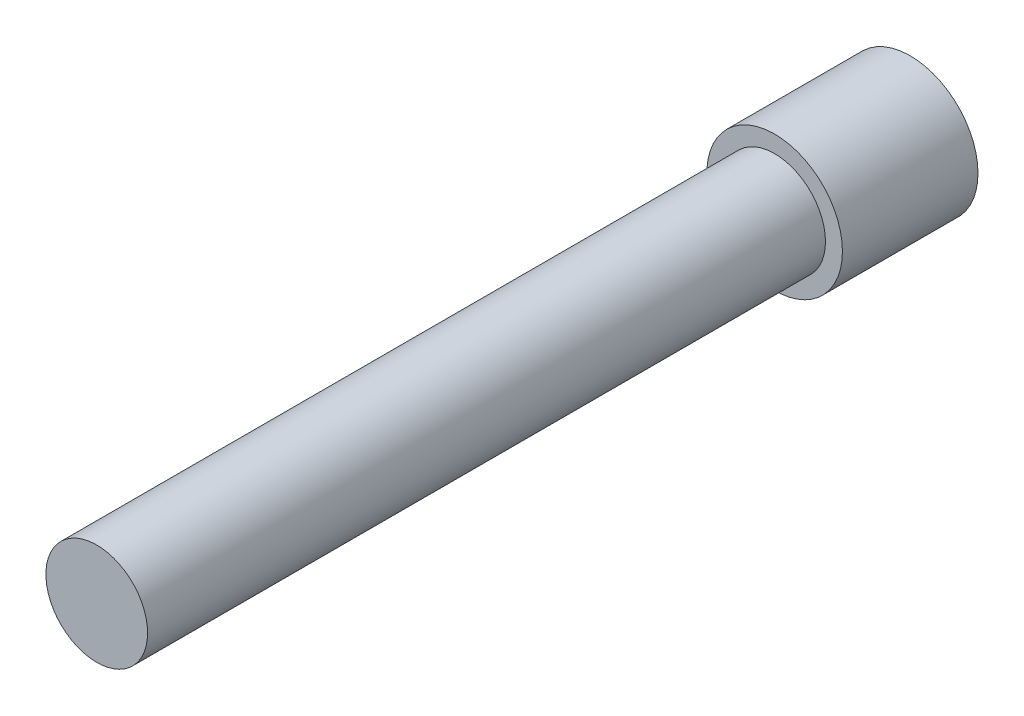
ISO-10303-21;
HEADER;
FILE_DESCRIPTION(('STEP AP214'),'2;1');
FILE_NAME('part.step','',(''),(''),'','','');
FILE_SCHEMA(('AUTOMOTIVE_DESIGN { 1 0 10303 214 1 1 1 1 }'));
ENDSEC;
DATA;
#1=APPLICATION_CONTEXT('core data for automotive mechanical design processes');
#2=APPLICATION_PROTOCOL_DEFINITION('international standard','automotive_design',2000,#1);
#3=PRODUCT_CONTEXT('',#1,'mechanical');
#4=PRODUCT('Part','Part','',(#3));
#5=PRODUCT_RELATED_PRODUCT_CATEGORY('part','',(#4));
#6=PRODUCT_DEFINITION_FORMATION('','',#4);
#7=PRODUCT_DEFINITION_CONTEXT('part definition',#1,'design');
#8=PRODUCT_DEFINITION('design','',#6,#7);
#9=PRODUCT_DEFINITION_SHAPE('','',#8);
#10=(LENGTH_UNIT() NAMED_UNIT(*) SI_UNIT(.MILLI.,.METRE.));
#11=(NAMED_UNIT(*) PLANE_ANGLE_UNIT() SI_UNIT($,.RADIAN.));
#12=(NAMED_UNIT(*) SI_UNIT($,.STERADIAN.) SOLID_ANGLE_UNIT());
#13=UNCERTAINTY_MEASURE_WITH_UNIT(LENGTH_MEASURE(1.E-05),#10,'distance_accuracy_value','');
#14=(GEOMETRIC_REPRESENTATION_CONTEXT(3) GLOBAL_UNCERTAINTY_ASSIGNED_CONTEXT((#13)) GLOBAL_UNIT_ASSIGNED_CONTEXT((#10,
#11,#12)) REPRESENTATION_CONTEXT('',''));
#15=CARTESIAN_POINT('',(0.,0.,0.));
#16=DIRECTION('',(0.,0.,1.));
#17=DIRECTION('',(1.,0.,0.));
#18=AXIS2_PLACEMENT_3D('',#15,#16,#17);
#19=CARTESIAN_POINT('',(0.,0.,20.));
#20=DIRECTION('',(0.,0.,-1.));
#21=DIRECTION('',(-1.,0.,0.));
#22=AXIS2_PLACEMENT_3D('',#19,#20,#21);
#23=CYLINDRICAL_SURFACE('',#22,10.);
#24=CARTESIAN_POINT('',(0.,0.,20.));
#25=DIRECTION('',(0.,0.,1.));
#26=DIRECTION('',(1.,0.,0.));
#27=AXIS2_PLACEMENT_3D('',#24,#25,#26);
#28=CIRCLE('',#27,10.);
#29=CARTESIAN_POINT('',(10.,0.,20.));
#30=VERTEX_POINT('',#29);
#31=EDGE_CURVE('E46',#30,#30,#28,.T.);
#32=ORIENTED_EDGE('',*,*,#31,.F.);
#33=EDGE_LOOP('',(#32));
#34=FACE_BOUND('',#33,.T.);
#35=CARTESIAN_POINT('',(0.,0.,0.));
#36=DIRECTION('',(0.,0.,1.));
#37=DIRECTION('',(1.,0.,0.));
#38=AXIS2_PLACEMENT_3D('',#35,#36,#37);
#39=CIRCLE('',#38,10.);
#40=CARTESIAN_POINT('',(10.,0.,0.));
#41=VERTEX_POINT('',#40);
#42=EDGE_CURVE('E42',#41,#41,#39,.T.);
#43=ORIENTED_EDGE('',*,*,#42,.T.);
#44=EDGE_LOOP('',(#43));
#45=FACE_BOUND('',#44,.T.);
#46=ADVANCED_FACE('F39',(#34,#45),#23,.T.);
#47=CARTESIAN_POINT('',(0.,0.,20.));
#48=DIRECTION('',(0.,0.,1.));
#49=DIRECTION('',(1.,0.,0.));
#50=AXIS2_PLACEMENT_3D('',#47,#48,#49);
#51=PLANE('',#50);
#52=CARTESIAN_POINT('',(0.,0.,20.));
#53=DIRECTION('',(0.,0.,1.));
#54=DIRECTION('',(1.,0.,0.));
#55=AXIS2_PLACEMENT_3D('',#52,#53,#54);
#56=CIRCLE('',#55,7.5);
#57=CARTESIAN_POINT('',(7.5,0.,20.));
#58=VERTEX_POINT('',#57);
#59=EDGE_CURVE('E10',#58,#58,#56,.T.);
#60=ORIENTED_EDGE('',*,*,#59,.F.);
#61=EDGE_LOOP('',(#60));
#62=FACE_BOUND('',#61,.T.);
#63=ORIENTED_EDGE('',*,*,#31,.T.);
#64=EDGE_LOOP('',(#63));
#65=FACE_BOUND('',#64,.T.);
#66=ADVANCED_FACE('F63',(#62,#65),#51,.T.);
#67=CARTESIAN_POINT('',(0.,0.,0.));
#68=DIRECTION('',(0.,0.,1.));
#69=DIRECTION('',(1.,0.,0.));
#70=AXIS2_PLACEMENT_3D('',#67,#68,#69);
#71=PLANE('',#70);
#72=ORIENTED_EDGE('',*,*,#42,.F.);
#73=EDGE_LOOP('',(#72));
#74=FACE_BOUND('',#73,.T.);
#75=ADVANCED_FACE('F60',(#74),#71,.F.);
#76=CARTESIAN_POINT('',(0.,0.,120.));
#77=DIRECTION('',(0.,0.,-1.));
#78=DIRECTION('',(-1.,0.,0.));
#79=AXIS2_PLACEMENT_3D('',#76,#77,#78);
#80=CYLINDRICAL_SURFACE('',#79,7.5);
#81=CARTESIAN_POINT('',(0.,0.,120.));
#82=DIRECTION('',(0.,0.,1.));
#83=DIRECTION('',(1.,0.,0.));
#84=AXIS2_PLACEMENT_3D('',#81,#82,#83);
#85=CIRCLE('',#84,7.5);
#86=CARTESIAN_POINT('',(7.5,0.,120.));
#87=VERTEX_POINT('',#86);
#88=EDGE_CURVE('E52',#87,#87,#85,.T.);
#89=ORIENTED_EDGE('',*,*,#88,.F.);
#90=EDGE_LOOP('',(#89));
#91=FACE_BOUND('',#90,.T.);
#92=ORIENTED_EDGE('',*,*,#59,.T.);
#93=EDGE_LOOP('',(#92));
#94=FACE_BOUND('',#93,.T.);
#95=ADVANCED_FACE('F62',(#91,#94),#80,.T.);
#96=CARTESIAN_POINT('',(0.,0.,120.));
#97=DIRECTION('',(0.,0.,1.));
#98=DIRECTION('',(1.,0.,0.));
#99=AXIS2_PLACEMENT_3D('',#96,#97,#98);
#100=PLANE('',#99);
#101=ORIENTED_EDGE('',*,*,#88,.T.);
#102=EDGE_LOOP('',(#101));
#103=FACE_BOUND('',#102,.T.);
#104=ADVANCED_FACE('F69',(#103),#100,.T.);
#105=CLOSED_SHELL('',(#46,#66,#75,#95,#104));
#106=MANIFOLD_SOLID_BREP('B2',#105);
#107=ADVANCED_BREP_SHAPE_REPRESENTATION('',(#18,#106),#14);
#108=SHAPE_DEFINITION_REPRESENTATION(#9,#107);
ENDSEC;
END-ISO-10303-21;
